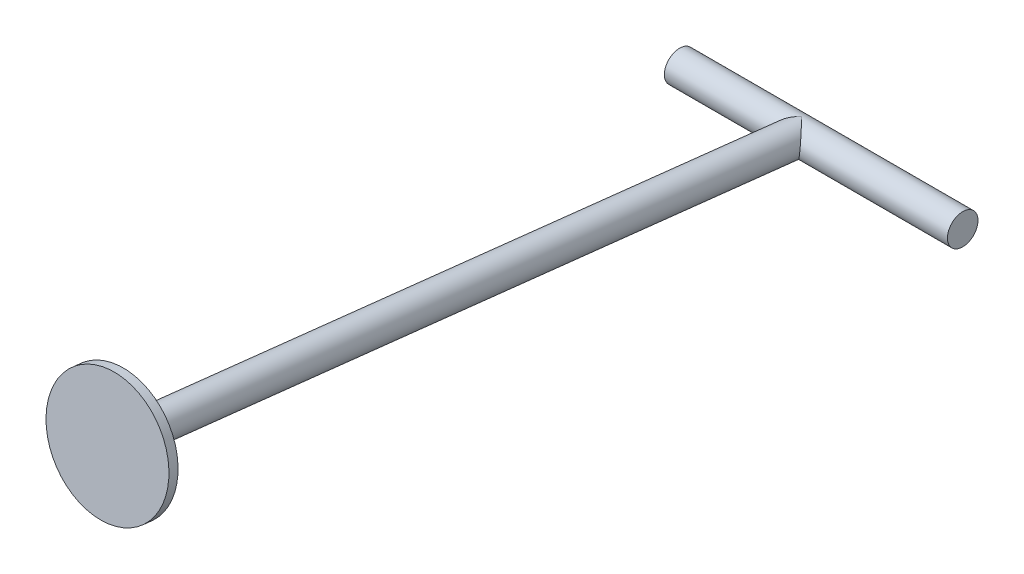
ISO-10303-21;
HEADER;
FILE_DESCRIPTION(('STEP AP214'),'2;1');
FILE_NAME('part.step','',(''),(''),'','','');
FILE_SCHEMA(('AUTOMOTIVE_DESIGN { 1 0 10303 214 1 1 1 1 }'));
ENDSEC;
DATA;
#1=APPLICATION_CONTEXT('core data for automotive mechanical design processes');
#2=APPLICATION_PROTOCOL_DEFINITION('international standard','automotive_design',2000,#1);
#3=PRODUCT_CONTEXT('',#1,'mechanical');
#4=PRODUCT('Part','Part','',(#3));
#5=PRODUCT_RELATED_PRODUCT_CATEGORY('part','',(#4));
#6=PRODUCT_DEFINITION_FORMATION('','',#4);
#7=PRODUCT_DEFINITION_CONTEXT('part definition',#1,'design');
#8=PRODUCT_DEFINITION('design','',#6,#7);
#9=PRODUCT_DEFINITION_SHAPE('','',#8);
#10=(LENGTH_UNIT() NAMED_UNIT(*) SI_UNIT(.MILLI.,.METRE.));
#11=(NAMED_UNIT(*) PLANE_ANGLE_UNIT() SI_UNIT($,.RADIAN.));
#12=(NAMED_UNIT(*) SI_UNIT($,.STERADIAN.) SOLID_ANGLE_UNIT());
#13=UNCERTAINTY_MEASURE_WITH_UNIT(LENGTH_MEASURE(1.E-05),#10,'distance_accuracy_value','');
#14=(GEOMETRIC_REPRESENTATION_CONTEXT(3) GLOBAL_UNCERTAINTY_ASSIGNED_CONTEXT((#13)) GLOBAL_UNIT_ASSIGNED_CONTEXT((#10,
#11,#12)) REPRESENTATION_CONTEXT('',''));
#15=CARTESIAN_POINT('',(0.,0.,0.));
#16=DIRECTION('',(0.,0.,1.));
#17=DIRECTION('',(1.,0.,0.));
#18=AXIS2_PLACEMENT_3D('',#15,#16,#17);
#19=CARTESIAN_POINT('',(-736.756841680339,1500.19071610714,5751.60102574659));
#20=DIRECTION('',(1.,0.,0.));
#21=DIRECTION('',(0.,0.,-1.));
#22=AXIS2_PLACEMENT_3D('',#19,#20,#21);
#23=CYLINDRICAL_SURFACE('',#22,25.0000000000004);
#24=CARTESIAN_POINT('',(-666.046163561683,1500.19071610704,5751.60102574654));
#25=DIRECTION('',(1.,0.,0.));
#26=DIRECTION('',(0.,-0.898638149523389,0.438690638401573));
#27=AXIS2_PLACEMENT_3D('',#24,#25,#26);
#28=CIRCLE('',#27,25.0000000000005);
#29=CARTESIAN_POINT('',(-666.046163561683,1477.72476236895,5762.56829170658));
#30=VERTEX_POINT('',#29);
#31=EDGE_CURVE('E11',#30,#30,#28,.T.);
#32=ORIENTED_EDGE('',*,*,#31,.T.);
#33=EDGE_LOOP('',(#32));
#34=FACE_BOUND('',#33,.T.);
#35=CARTESIAN_POINT('',(-202.746163561712,1500.19071610714,5751.60102574659));
#36=DIRECTION('',(1.,0.,0.));
#37=DIRECTION('',(0.,0.,-1.));
#38=AXIS2_PLACEMENT_3D('',#35,#36,#37);
#39=CIRCLE('',#38,25.0000000000004);
#40=CARTESIAN_POINT('',(-202.746163561712,1500.19071610714,5726.60102574659));
#41=VERTEX_POINT('',#40);
#42=EDGE_CURVE('E42',#41,#41,#39,.T.);
#43=ORIENTED_EDGE('',*,*,#42,.F.);
#44=EDGE_LOOP('',(#43));
#45=FACE_BOUND('',#44,.T.);
#46=CARTESIAN_POINT('',(-469.396163561703,1500.19071610714,5751.60102574659));
#47=DIRECTION('',(-0.707106781186548,0.078137197406868,0.702776335957181));
#48=DIRECTION('',(0.707106781186548,0.078137197406868,0.702776335957181));
#49=AXIS2_PLACEMENT_3D('',#46,#47,#48);
#50=ELLIPSE('',#49,35.3553390593282,25.0000000000006);
#51=CARTESIAN_POINT('',(-469.396163561703,1475.3438204665,5754.36359285406));
#52=VERTEX_POINT('',#51);
#53=CARTESIAN_POINT('',(-469.396163561703,1525.03761174778,5748.83845863912));
#54=VERTEX_POINT('',#53);
#55=EDGE_CURVE('E54',#52,#54,#50,.T.);
#56=ORIENTED_EDGE('',*,*,#55,.F.);
#57=CARTESIAN_POINT('',(-469.396163561703,1500.19071610714,5751.60102574659));
#58=DIRECTION('',(0.707106781186548,0.078137197406868,0.702776335957181));
#59=DIRECTION('',(-0.707106781186548,0.078137197406868,0.702776335957181));
#60=AXIS2_PLACEMENT_3D('',#57,#58,#59);
#61=ELLIPSE('',#60,35.3553390593282,25.0000000000006);
#62=EDGE_CURVE('E52',#54,#52,#61,.T.);
#63=ORIENTED_EDGE('',*,*,#62,.F.);
#64=EDGE_LOOP('',(#56,#63));
#65=FACE_BOUND('',#64,.T.);
#66=ADVANCED_FACE('F39',(#34,#45,#65),#23,.T.);
#67=CARTESIAN_POINT('',(-202.746163561712,1500.19071610714,5751.60102574659));
#68=DIRECTION('',(1.,0.,0.));
#69=DIRECTION('',(0.,0.,-1.));
#70=AXIS2_PLACEMENT_3D('',#67,#68,#69);
#71=PLANE('',#70);
#72=ORIENTED_EDGE('',*,*,#42,.T.);
#73=EDGE_LOOP('',(#72));
#74=FACE_BOUND('',#73,.T.);
#75=ADVANCED_FACE('F89',(#74),#71,.T.);
#76=CARTESIAN_POINT('',(-666.046163561683,1500.19071610704,5751.60102574654));
#77=DIRECTION('',(1.,0.,0.));
#78=DIRECTION('',(0.,-0.898638149523389,0.438690638401573));
#79=AXIS2_PLACEMENT_3D('',#76,#77,#78);
#80=PLANE('',#79);
#81=ORIENTED_EDGE('',*,*,#31,.F.);
#82=EDGE_LOOP('',(#81));
#83=FACE_BOUND('',#82,.T.);
#84=ADVANCED_FACE('F96',(#83),#80,.F.);
#85=CARTESIAN_POINT('',(-469.396163561703,1497.4279279943,5726.75214235423));
#86=DIRECTION('',(0.,0.110502684298617,0.993875825625515));
#87=DIRECTION('',(0.,-0.993875825625516,0.110502684298617));
#88=AXIS2_PLACEMENT_3D('',#85,#86,#87);
#89=CYLINDRICAL_SURFACE('',#88,25.0000000000007);
#90=ORIENTED_EDGE('',*,*,#55,.T.);
#91=ORIENTED_EDGE('',*,*,#62,.T.);
#92=EDGE_LOOP('',(#90,#91));
#93=FACE_BOUND('',#92,.T.);
#94=CARTESIAN_POINT('',(-469.396163561703,1624.50623594309,6869.71132957529));
#95=DIRECTION('',(0.,-0.110502684298617,-0.993875825625516));
#96=DIRECTION('',(0.,0.993875825625516,-0.110502684298617));
#97=AXIS2_PLACEMENT_3D('',#94,#95,#96);
#98=CIRCLE('',#97,25.0000000000007);
#99=CARTESIAN_POINT('',(-469.396163561703,1649.35313158373,6866.94876246783));
#100=VERTEX_POINT('',#99);
#101=EDGE_CURVE('E58',#100,#100,#98,.T.);
#102=ORIENTED_EDGE('',*,*,#101,.T.);
#103=EDGE_LOOP('',(#102));
#104=FACE_BOUND('',#103,.T.);
#105=ADVANCED_FACE('F55',(#93,#104),#89,.T.);
#106=CARTESIAN_POINT('',(-469.396163561703,1624.50623594309,6869.71132957529));
#107=DIRECTION('',(0.,0.110502684298617,0.993875825625515));
#108=DIRECTION('',(0.,-0.993875825625516,0.110502684298617));
#109=AXIS2_PLACEMENT_3D('',#106,#107,#108);
#110=CYLINDRICAL_SURFACE('',#109,100.);
#111=CARTESIAN_POINT('',(-469.396163561703,1624.50623594309,6869.71132957529));
#112=DIRECTION('',(0.,-0.110502684298617,-0.993875825625516));
#113=DIRECTION('',(0.,0.993875825625516,-0.110502684298617));
#114=AXIS2_PLACEMENT_3D('',#111,#112,#113);
#115=CIRCLE('',#114,100.);
#116=CARTESIAN_POINT('',(-469.396163561703,1525.11865338054,6880.76159800515));
#117=VERTEX_POINT('',#116);
#118=EDGE_CURVE('E65',#117,#117,#115,.T.);
#119=CARTESIAN_POINT('',(-469.396163561703,1626.16377620757,6884.61946695967));
#120=DIRECTION('',(0.,-0.110502684298617,-0.993875825625516));
#121=DIRECTION('',(0.,0.993875825625516,-0.110502684298617));
#122=AXIS2_PLACEMENT_3D('',#119,#120,#121);
#123=CIRCLE('',#122,100.);
#124=CARTESIAN_POINT('',(-469.396163561703,1526.77619364502,6895.66973538953));
#125=VERTEX_POINT('',#124);
#126=EDGE_CURVE('E66',#125,#125,#123,.T.);
#127=CARTESIAN_POINT('',(-469.396163561703,1525.11865338054,6880.76159800515));
#128=CARTESIAN_POINT('',(-469.396163561703,1525.13591942496,6880.9168911029));
#129=CARTESIAN_POINT('',(-469.396163561703,1525.15318546938,6881.07218420066));
#130=CARTESIAN_POINT('',(-469.396163561703,1525.18771755822,6881.38277039617));
#131=CARTESIAN_POINT('',(-469.396163561703,1525.20498360264,6881.53806349392));
#132=CARTESIAN_POINT('',(-469.396163561703,1525.23951569149,6881.84864968943));
#133=CARTESIAN_POINT('',(-469.396163561703,1525.25678173591,6882.00394278718));
#134=CARTESIAN_POINT('',(-469.396163561703,1525.29131382475,6882.31452898269));
#135=CARTESIAN_POINT('',(-469.396163561703,1525.30857986917,6882.46982208044));
#136=CARTESIAN_POINT('',(-469.396163561703,1525.34311195802,6882.78040827595));
#137=CARTESIAN_POINT('',(-469.396163561703,1525.36037800244,6882.93570137371));
#138=CARTESIAN_POINT('',(-469.396163561703,1525.39491009128,6883.24628756921));
#139=CARTESIAN_POINT('',(-469.396163561703,1525.4121761357,6883.40158066697));
#140=CARTESIAN_POINT('',(-469.396163561703,1525.44670822455,6883.71216686248));
#141=CARTESIAN_POINT('',(-469.396163561703,1525.46397426897,6883.86745996023));
#142=CARTESIAN_POINT('',(-469.396163561703,1525.49850635781,6884.17804615574));
#143=CARTESIAN_POINT('',(-469.396163561703,1525.51577240223,6884.33333925349));
#144=CARTESIAN_POINT('',(-469.396163561703,1525.55030449108,6884.643925449));
#145=CARTESIAN_POINT('',(-469.396163561703,1525.5675705355,6884.79921854675));
#146=CARTESIAN_POINT('',(-469.396163561703,1525.60210262434,6885.10980474226));
#147=CARTESIAN_POINT('',(-469.396163561703,1525.61936866876,6885.26509784002));
#148=CARTESIAN_POINT('',(-469.396163561703,1525.65390075761,6885.57568403552));
#149=CARTESIAN_POINT('',(-469.396163561703,1525.67116680203,6885.73097713328));
#150=CARTESIAN_POINT('',(-469.396163561703,1525.70569889087,6886.04156332879));
#151=CARTESIAN_POINT('',(-469.396163561703,1525.72296493529,6886.19685642654));
#152=CARTESIAN_POINT('',(-469.396163561703,1525.75749702414,6886.50744262205));
#153=CARTESIAN_POINT('',(-469.396163561703,1525.77476306856,6886.6627357198));
#154=CARTESIAN_POINT('',(-469.396163561703,1525.8092951574,6886.97332191531));
#155=CARTESIAN_POINT('',(-469.396163561703,1525.82656120182,6887.12861501306));
#156=CARTESIAN_POINT('',(-469.396163561703,1525.86109329067,6887.43920120857));
#157=CARTESIAN_POINT('',(-469.396163561703,1525.87835933509,6887.59449430633));
#158=CARTESIAN_POINT('',(-469.396163561703,1525.91289142393,6887.90508050183));
#159=CARTESIAN_POINT('',(-469.396163561703,1525.93015746835,6888.06037359959));
#160=CARTESIAN_POINT('',(-469.396163561703,1525.9646895572,6888.3709597951));
#161=CARTESIAN_POINT('',(-469.396163561703,1525.98195560162,6888.52625289285));
#162=CARTESIAN_POINT('',(-469.396163561703,1526.01648769046,6888.83683908836));
#163=CARTESIAN_POINT('',(-469.396163561703,1526.03375373488,6888.99213218611));
#164=CARTESIAN_POINT('',(-469.396163561703,1526.06828582373,6889.30271838162));
#165=CARTESIAN_POINT('',(-469.396163561703,1526.08555186815,6889.45801147937));
#166=CARTESIAN_POINT('',(-469.396163561703,1526.12008395699,6889.76859767488));
#167=CARTESIAN_POINT('',(-469.396163561703,1526.13735000141,6889.92389077264));
#168=CARTESIAN_POINT('',(-469.396163561703,1526.17188209026,6890.23447696814));
#169=CARTESIAN_POINT('',(-469.396163561703,1526.18914813468,6890.3897700659));
#170=CARTESIAN_POINT('',(-469.396163561703,1526.22368022352,6890.70035626141));
#171=CARTESIAN_POINT('',(-469.396163561703,1526.24094626794,6890.85564935916));
#172=CARTESIAN_POINT('',(-469.396163561703,1526.27547835679,6891.16623555467));
#173=CARTESIAN_POINT('',(-469.396163561703,1526.29274440121,6891.32152865242));
#174=CARTESIAN_POINT('',(-469.396163561703,1526.32727649005,6891.63211484793));
#175=CARTESIAN_POINT('',(-469.396163561703,1526.34454253447,6891.78740794568));
#176=CARTESIAN_POINT('',(-469.396163561703,1526.37907462332,6892.09799414119));
#177=CARTESIAN_POINT('',(-469.396163561703,1526.39634066774,6892.25328723895));
#178=CARTESIAN_POINT('',(-469.396163561703,1526.43087275658,6892.56387343445));
#179=CARTESIAN_POINT('',(-469.396163561703,1526.448138801,6892.71916653221));
#180=CARTESIAN_POINT('',(-469.396163561703,1526.48267088985,6893.02975272772));
#181=CARTESIAN_POINT('',(-469.396163561703,1526.49993693427,6893.18504582547));
#182=CARTESIAN_POINT('',(-469.396163561703,1526.53446902311,6893.49563202098));
#183=CARTESIAN_POINT('',(-469.396163561703,1526.55173506753,6893.65092511873));
#184=CARTESIAN_POINT('',(-469.396163561703,1526.58626715638,6893.96151131424));
#185=CARTESIAN_POINT('',(-469.396163561703,1526.6035332008,6894.11680441199));
#186=CARTESIAN_POINT('',(-469.396163561703,1526.63806528964,6894.4273906075));
#187=CARTESIAN_POINT('',(-469.396163561703,1526.65533133406,6894.58268370526));
#188=CARTESIAN_POINT('',(-469.396163561703,1526.68986342291,6894.89326990076));
#189=CARTESIAN_POINT('',(-469.396163561703,1526.70712946733,6895.04856299852));
#190=CARTESIAN_POINT('',(-469.396163561703,1526.74166155617,6895.35914919403));
#191=CARTESIAN_POINT('',(-469.396163561703,1526.75892760059,6895.51444229178));
#192=CARTESIAN_POINT('',(-469.396163561703,1526.77619364502,6895.66973538953));
#193=B_SPLINE_CURVE_WITH_KNOTS('',3,(#127,#128,#129,#130,#131,#132,#133,#134,#135,#136,#137,
#138,#139,#140,#141,#142,#143,#144,#145,#146,#147,#148,#149,#150,#151,#152,#153,#154,#155,#156,
#157,#158,#159,#160,#161,#162,#163,#164,#165,#166,#167,#168,#169,#170,#171,#172,#173,#174,#175,
#176,#177,#178,#179,#180,#181,#182,#183,#184,#185,#186,#187,#188,#189,#190,#191,#192),
.UNSPECIFIED.,.F.,.F.,(4,2,2,2,2,2,2,2,2,2,2,2,2,2,2,2,2,2,2,2,2,2,2,2,2,2,2,2,2,2,2,2,4),(0.,
0.468750000000407,0.937500000000815,1.40625000000031,1.87500000000072,2.34375000000022,
2.81250000000063,3.28125000000015,3.75000000000054,4.21875000000094,4.68750000000047,
5.15625000000085,5.62500000000038,6.09375000000078,6.56250000000028,7.03125000000069,
7.50000000000019,7.9687500000006,8.43750000000101,8.90625000000051,9.37500000000091,
9.84375000000044,10.3125000000008,10.7812500000003,11.2500000000008,11.7187500000011,
12.1875000000007,12.6562500000011,13.1250000000006,13.593750000001,14.0625000000005,
14.5312500000009,15.0000000000013),.UNSPECIFIED.);
#194=EDGE_CURVE('BSEAM74',#117,#125,#193,.T.);
#195=ORIENTED_EDGE('',*,*,#118,.F.);
#196=ORIENTED_EDGE('',*,*,#126,.T.);
#197=ORIENTED_EDGE('',*,*,#194,.T.);
#198=ORIENTED_EDGE('',*,*,#194,.F.);
#199=EDGE_LOOP('',(#195,#197,#196,#198));
#200=FACE_BOUND('',#199,.T.);
#201=ADVANCED_FACE('F74',(#200),#110,.T.);
#202=CARTESIAN_POINT('',(-469.396163561703,1624.50623594309,6869.71132957529));
#203=DIRECTION('',(0.,-0.110502684298617,-0.993875825625516));
#204=DIRECTION('',(0.,0.993875825625516,-0.110502684298617));
#205=AXIS2_PLACEMENT_3D('',#202,#203,#204);
#206=PLANE('',#205);
#207=ORIENTED_EDGE('',*,*,#101,.F.);
#208=EDGE_LOOP('',(#207));
#209=FACE_BOUND('',#208,.T.);
#210=ORIENTED_EDGE('',*,*,#118,.T.);
#211=EDGE_LOOP('',(#210));
#212=FACE_BOUND('',#211,.T.);
#213=ADVANCED_FACE('F72',(#209,#212),#206,.T.);
#214=CARTESIAN_POINT('',(-469.396163561703,1626.16377620757,6884.61946695967));
#215=DIRECTION('',(0.,-0.110502684298617,-0.993875825625516));
#216=DIRECTION('',(0.,0.993875825625516,-0.110502684298617));
#217=AXIS2_PLACEMENT_3D('',#214,#215,#216);
#218=PLANE('',#217);
#219=ORIENTED_EDGE('',*,*,#126,.F.);
#220=EDGE_LOOP('',(#219));
#221=FACE_BOUND('',#220,.T.);
#222=ADVANCED_FACE('F80',(#221),#218,.F.);
#223=CLOSED_SHELL('',(#66,#75,#84,#105,#201,#213,#222));
#224=MANIFOLD_SOLID_BREP('B2',#223);
#225=ADVANCED_BREP_SHAPE_REPRESENTATION('',(#18,#224),#14);
#226=SHAPE_DEFINITION_REPRESENTATION(#9,#225);
ENDSEC;
END-ISO-10303-21;
